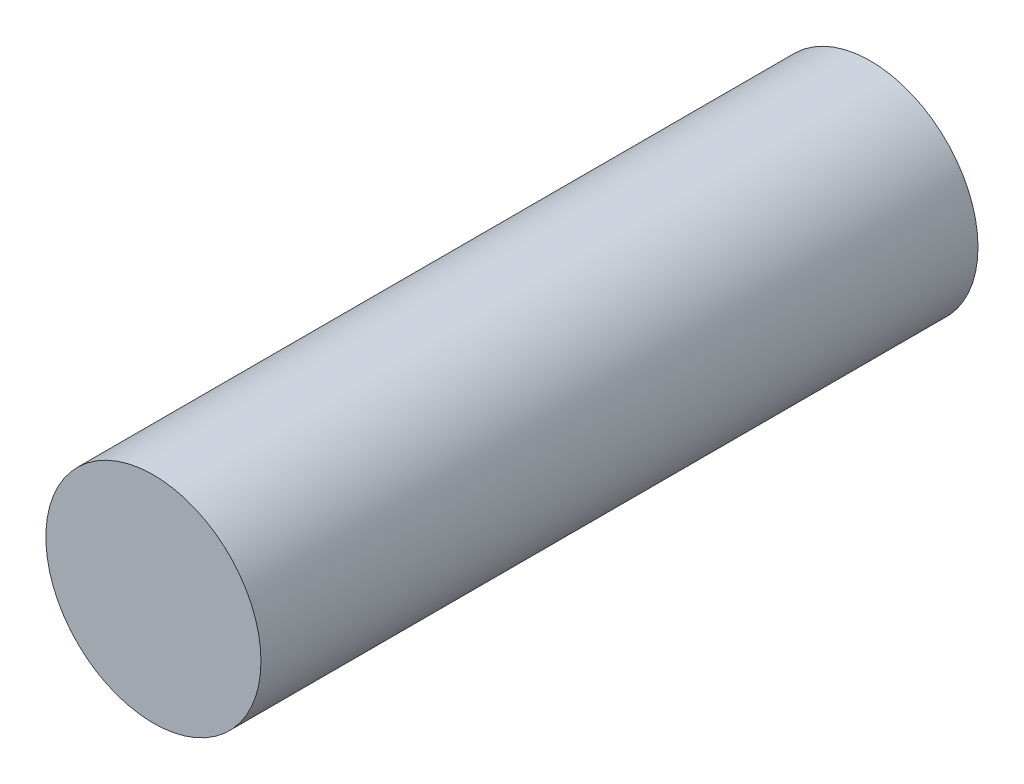
ISO-10303-21;
HEADER;
FILE_DESCRIPTION(('STEP AP214'),'2;1');
FILE_NAME('part.step','',(''),(''),'','','');
FILE_SCHEMA(('AUTOMOTIVE_DESIGN { 1 0 10303 214 1 1 1 1 }'));
ENDSEC;
DATA;
#1=APPLICATION_CONTEXT('core data for automotive mechanical design processes');
#2=APPLICATION_PROTOCOL_DEFINITION('international standard','automotive_design',2000,#1);
#3=PRODUCT_CONTEXT('',#1,'mechanical');
#4=PRODUCT('Part','Part','',(#3));
#5=PRODUCT_RELATED_PRODUCT_CATEGORY('part','',(#4));
#6=PRODUCT_DEFINITION_FORMATION('','',#4);
#7=PRODUCT_DEFINITION_CONTEXT('part definition',#1,'design');
#8=PRODUCT_DEFINITION('design','',#6,#7);
#9=PRODUCT_DEFINITION_SHAPE('','',#8);
#10=(LENGTH_UNIT() NAMED_UNIT(*) SI_UNIT(.MILLI.,.METRE.));
#11=(NAMED_UNIT(*) PLANE_ANGLE_UNIT() SI_UNIT($,.RADIAN.));
#12=(NAMED_UNIT(*) SI_UNIT($,.STERADIAN.) SOLID_ANGLE_UNIT());
#13=UNCERTAINTY_MEASURE_WITH_UNIT(LENGTH_MEASURE(1.E-05),#10,'distance_accuracy_value','');
#14=(GEOMETRIC_REPRESENTATION_CONTEXT(3) GLOBAL_UNCERTAINTY_ASSIGNED_CONTEXT((#13)) GLOBAL_UNIT_ASSIGNED_CONTEXT((#10,
#11,#12)) REPRESENTATION_CONTEXT('',''));
#15=CARTESIAN_POINT('',(0.,0.,0.));
#16=DIRECTION('',(0.,0.,1.));
#17=DIRECTION('',(1.,0.,0.));
#18=AXIS2_PLACEMENT_3D('',#15,#16,#17);
#19=CARTESIAN_POINT('',(0.,0.,10.));
#20=DIRECTION('',(0.,0.,-1.));
#21=DIRECTION('',(-1.,0.,0.));
#22=AXIS2_PLACEMENT_3D('',#19,#20,#21);
#23=CYLINDRICAL_SURFACE('',#22,1.5);
#24=CARTESIAN_POINT('',(0.,0.,10.));
#25=DIRECTION('',(0.,0.,1.));
#26=DIRECTION('',(1.,0.,0.));
#27=AXIS2_PLACEMENT_3D('',#24,#25,#26);
#28=CIRCLE('',#27,1.5);
#29=CARTESIAN_POINT('',(1.5,0.,10.));
#30=VERTEX_POINT('',#29);
#31=EDGE_CURVE('E10',#30,#30,#28,.T.);
#32=ORIENTED_EDGE('',*,*,#31,.F.);
#33=EDGE_LOOP('',(#32));
#34=FACE_BOUND('',#33,.T.);
#35=CARTESIAN_POINT('',(0.,0.,0.));
#36=DIRECTION('',(0.,0.,1.));
#37=DIRECTION('',(1.,0.,0.));
#38=AXIS2_PLACEMENT_3D('',#35,#36,#37);
#39=CIRCLE('',#38,1.5);
#40=CARTESIAN_POINT('',(1.5,0.,0.));
#41=VERTEX_POINT('',#40);
#42=EDGE_CURVE('E35',#41,#41,#39,.T.);
#43=ORIENTED_EDGE('',*,*,#42,.T.);
#44=EDGE_LOOP('',(#43));
#45=FACE_BOUND('',#44,.T.);
#46=ADVANCED_FACE('F32',(#34,#45),#23,.T.);
#47=CARTESIAN_POINT('',(0.,0.,10.));
#48=DIRECTION('',(0.,0.,1.));
#49=DIRECTION('',(1.,0.,0.));
#50=AXIS2_PLACEMENT_3D('',#47,#48,#49);
#51=PLANE('',#50);
#52=ORIENTED_EDGE('',*,*,#31,.T.);
#53=EDGE_LOOP('',(#52));
#54=FACE_BOUND('',#53,.T.);
#55=ADVANCED_FACE('F61',(#54),#51,.T.);
#56=CARTESIAN_POINT('',(0.,0.,0.));
#57=DIRECTION('',(0.,0.,1.));
#58=DIRECTION('',(1.,0.,0.));
#59=AXIS2_PLACEMENT_3D('',#56,#57,#58);
#60=PLANE('',#59);
#61=CARTESIAN_POINT('',(0.,0.,0.));
#62=DIRECTION('',(0.,0.,-1.));
#63=DIRECTION('',(-1.,0.,0.));
#64=AXIS2_PLACEMENT_3D('',#61,#62,#63);
#65=CIRCLE('',#64,0.79375);
#66=CARTESIAN_POINT('',(-0.79375,0.,0.));
#67=VERTEX_POINT('',#66);
#68=EDGE_CURVE('E44',#67,#67,#65,.T.);
#69=ORIENTED_EDGE('',*,*,#68,.F.);
#70=EDGE_LOOP('',(#69));
#71=FACE_BOUND('',#70,.T.);
#72=ORIENTED_EDGE('',*,*,#42,.F.);
#73=EDGE_LOOP('',(#72));
#74=FACE_BOUND('',#73,.T.);
#75=ADVANCED_FACE('F55',(#71,#74),#60,.F.);
#76=CARTESIAN_POINT('',(0.,0.,3.5));
#77=DIRECTION('',(0.,0.,-1.));
#78=DIRECTION('',(-1.,0.,0.));
#79=AXIS2_PLACEMENT_3D('',#76,#77,#78);
#80=CYLINDRICAL_SURFACE('',#79,0.79375);
#81=CARTESIAN_POINT('',(0.,0.,3.5));
#82=DIRECTION('',(0.,0.,-1.));
#83=DIRECTION('',(-1.,0.,0.));
#84=AXIS2_PLACEMENT_3D('',#81,#82,#83);
#85=CIRCLE('',#84,0.79375);
#86=CARTESIAN_POINT('',(-0.79375,0.,3.5));
#87=VERTEX_POINT('',#86);
#88=EDGE_CURVE('E42',#87,#87,#85,.T.);
#89=ORIENTED_EDGE('',*,*,#88,.F.);
#90=EDGE_LOOP('',(#89));
#91=FACE_BOUND('',#90,.T.);
#92=ORIENTED_EDGE('',*,*,#68,.T.);
#93=EDGE_LOOP('',(#92));
#94=FACE_BOUND('',#93,.T.);
#95=ADVANCED_FACE('F52',(#91,#94),#80,.F.);
#96=CARTESIAN_POINT('',(0.,0.,3.5));
#97=DIRECTION('',(0.,0.,-1.));
#98=DIRECTION('',(-1.,0.,0.));
#99=AXIS2_PLACEMENT_3D('',#96,#97,#98);
#100=PLANE('',#99);
#101=ORIENTED_EDGE('',*,*,#88,.T.);
#102=EDGE_LOOP('',(#101));
#103=FACE_BOUND('',#102,.T.);
#104=ADVANCED_FACE('F50',(#103),#100,.T.);
#105=CLOSED_SHELL('',(#46,#55,#75,#95,#104));
#106=MANIFOLD_SOLID_BREP('B2',#105);
#107=ADVANCED_BREP_SHAPE_REPRESENTATION('',(#18,#106),#14);
#108=SHAPE_DEFINITION_REPRESENTATION(#9,#107);
ENDSEC;
END-ISO-10303-21;
